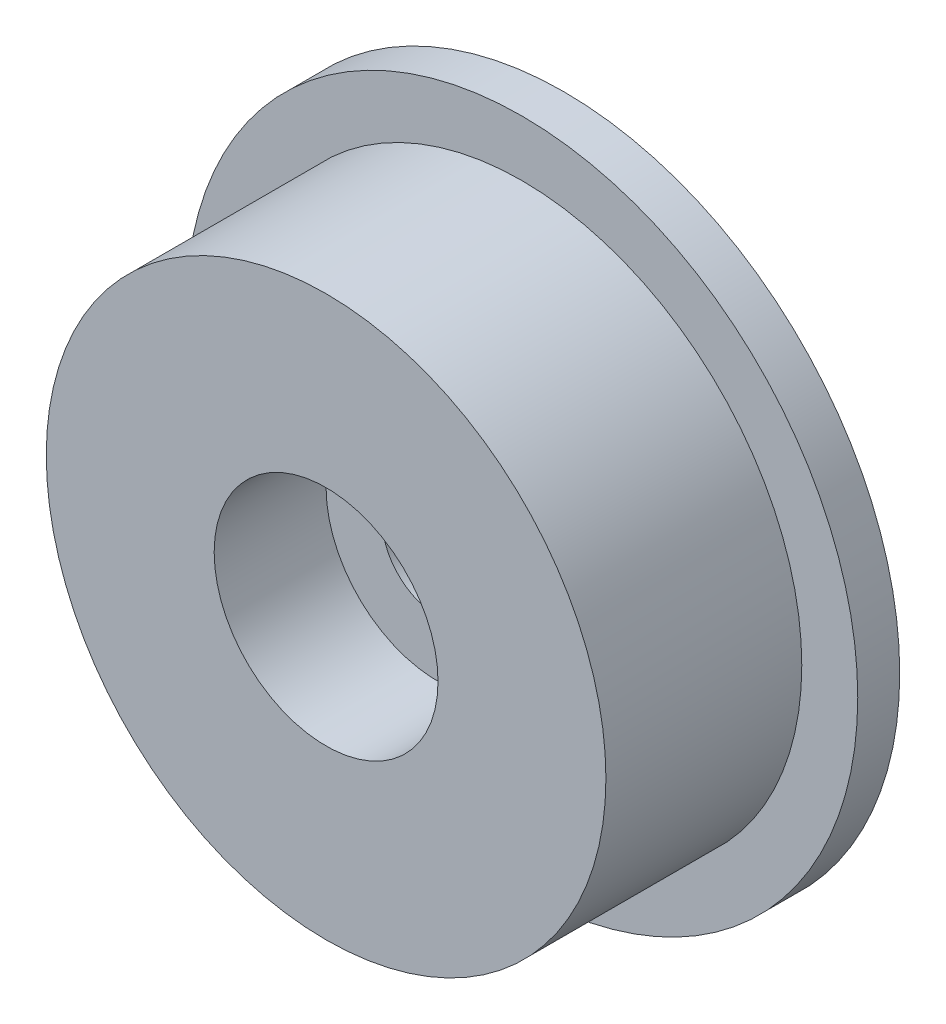
ISO-10303-21;
HEADER;
FILE_DESCRIPTION(('STEP AP214'),'2;1');
FILE_NAME('part.step','',(''),(''),'','','');
FILE_SCHEMA(('AUTOMOTIVE_DESIGN { 1 0 10303 214 1 1 1 1 }'));
ENDSEC;
DATA;
#1=APPLICATION_CONTEXT('core data for automotive mechanical design processes');
#2=APPLICATION_PROTOCOL_DEFINITION('international standard','automotive_design',2000,#1);
#3=PRODUCT_CONTEXT('',#1,'mechanical');
#4=PRODUCT('Part','Part','',(#3));
#5=PRODUCT_RELATED_PRODUCT_CATEGORY('part','',(#4));
#6=PRODUCT_DEFINITION_FORMATION('','',#4);
#7=PRODUCT_DEFINITION_CONTEXT('part definition',#1,'design');
#8=PRODUCT_DEFINITION('design','',#6,#7);
#9=PRODUCT_DEFINITION_SHAPE('','',#8);
#10=(LENGTH_UNIT() NAMED_UNIT(*) SI_UNIT(.MILLI.,.METRE.));
#11=(NAMED_UNIT(*) PLANE_ANGLE_UNIT() SI_UNIT($,.RADIAN.));
#12=(NAMED_UNIT(*) SI_UNIT($,.STERADIAN.) SOLID_ANGLE_UNIT());
#13=UNCERTAINTY_MEASURE_WITH_UNIT(LENGTH_MEASURE(1.E-05),#10,'distance_accuracy_value','');
#14=(GEOMETRIC_REPRESENTATION_CONTEXT(3) GLOBAL_UNCERTAINTY_ASSIGNED_CONTEXT((#13)) GLOBAL_UNIT_ASSIGNED_CONTEXT((#10,
#11,#12)) REPRESENTATION_CONTEXT('',''));
#15=CARTESIAN_POINT('',(0.,0.,0.));
#16=DIRECTION('',(0.,0.,1.));
#17=DIRECTION('',(1.,0.,0.));
#18=AXIS2_PLACEMENT_3D('',#15,#16,#17);
#19=CARTESIAN_POINT('',(0.,0.,27.));
#20=DIRECTION('',(0.,0.,-1.));
#21=DIRECTION('',(-1.,0.,0.));
#22=AXIS2_PLACEMENT_3D('',#19,#20,#21);
#23=CYLINDRICAL_SURFACE('',#22,2.);
#24=CARTESIAN_POINT('',(0.,0.,0.));
#25=DIRECTION('',(0.,0.,-1.));
#26=DIRECTION('',(-1.,0.,0.));
#27=AXIS2_PLACEMENT_3D('',#24,#25,#26);
#28=CIRCLE('',#27,2.);
#29=CARTESIAN_POINT('',(-2.,0.,0.));
#30=VERTEX_POINT('',#29);
#31=EDGE_CURVE('E63',#30,#30,#28,.T.);
#32=ORIENTED_EDGE('',*,*,#31,.T.);
#33=EDGE_LOOP('',(#32));
#34=FACE_BOUND('',#33,.T.);
#35=CARTESIAN_POINT('',(0.,0.,4.5));
#36=DIRECTION('',(0.,0.,1.));
#37=DIRECTION('',(1.,0.,0.));
#38=AXIS2_PLACEMENT_3D('',#35,#36,#37);
#39=CIRCLE('',#38,2.);
#40=CARTESIAN_POINT('',(2.,0.,4.5));
#41=VERTEX_POINT('',#40);
#42=EDGE_CURVE('E41',#41,#41,#39,.F.);
#43=ORIENTED_EDGE('',*,*,#42,.F.);
#44=EDGE_LOOP('',(#43));
#45=FACE_BOUND('',#44,.T.);
#46=ADVANCED_FACE('F37',(#34,#45),#23,.F.);
#47=CARTESIAN_POINT('',(0.,0.,1.5));
#48=DIRECTION('',(0.,0.,-1.));
#49=DIRECTION('',(-1.,0.,0.));
#50=AXIS2_PLACEMENT_3D('',#47,#48,#49);
#51=CYLINDRICAL_SURFACE('',#50,12.);
#52=CARTESIAN_POINT('',(0.,0.,1.5));
#53=DIRECTION('',(0.,0.,1.));
#54=DIRECTION('',(1.,0.,0.));
#55=AXIS2_PLACEMENT_3D('',#52,#53,#54);
#56=CIRCLE('',#55,12.);
#57=CARTESIAN_POINT('',(12.,0.,1.5));
#58=VERTEX_POINT('',#57);
#59=EDGE_CURVE('E46',#58,#58,#56,.T.);
#60=ORIENTED_EDGE('',*,*,#59,.F.);
#61=EDGE_LOOP('',(#60));
#62=FACE_BOUND('',#61,.T.);
#63=CARTESIAN_POINT('',(0.,0.,0.));
#64=DIRECTION('',(0.,0.,1.));
#65=DIRECTION('',(1.,0.,0.));
#66=AXIS2_PLACEMENT_3D('',#63,#64,#65);
#67=CIRCLE('',#66,12.);
#68=CARTESIAN_POINT('',(12.,0.,0.));
#69=VERTEX_POINT('',#68);
#70=EDGE_CURVE('E52',#69,#69,#67,.T.);
#71=ORIENTED_EDGE('',*,*,#70,.T.);
#72=EDGE_LOOP('',(#71));
#73=FACE_BOUND('',#72,.T.);
#74=ADVANCED_FACE('F39',(#62,#73),#51,.T.);
#75=CARTESIAN_POINT('',(0.,0.,1.5));
#76=DIRECTION('',(0.,0.,1.));
#77=DIRECTION('',(1.,0.,0.));
#78=AXIS2_PLACEMENT_3D('',#75,#76,#77);
#79=PLANE('',#78);
#80=CARTESIAN_POINT('',(0.,0.,1.5));
#81=DIRECTION('',(0.,0.,1.));
#82=DIRECTION('',(1.,0.,0.));
#83=AXIS2_PLACEMENT_3D('',#80,#81,#82);
#84=CIRCLE('',#83,10.);
#85=CARTESIAN_POINT('',(10.,0.,1.5));
#86=VERTEX_POINT('',#85);
#87=EDGE_CURVE('E10',#86,#86,#84,.T.);
#88=ORIENTED_EDGE('',*,*,#87,.F.);
#89=EDGE_LOOP('',(#88));
#90=FACE_BOUND('',#89,.T.);
#91=ORIENTED_EDGE('',*,*,#59,.T.);
#92=EDGE_LOOP('',(#91));
#93=FACE_BOUND('',#92,.T.);
#94=ADVANCED_FACE('F108',(#90,#93),#79,.T.);
#95=CARTESIAN_POINT('',(0.,0.,0.));
#96=DIRECTION('',(0.,0.,1.));
#97=DIRECTION('',(1.,0.,0.));
#98=AXIS2_PLACEMENT_3D('',#95,#96,#97);
#99=PLANE('',#98);
#100=ORIENTED_EDGE('',*,*,#31,.F.);
#101=EDGE_LOOP('',(#100));
#102=FACE_BOUND('',#101,.T.);
#103=ORIENTED_EDGE('',*,*,#70,.F.);
#104=EDGE_LOOP('',(#103));
#105=FACE_BOUND('',#104,.T.);
#106=ADVANCED_FACE('F100',(#102,#105),#99,.F.);
#107=CARTESIAN_POINT('',(0.,0.,8.5));
#108=DIRECTION('',(0.,0.,-1.));
#109=DIRECTION('',(-1.,0.,0.));
#110=AXIS2_PLACEMENT_3D('',#107,#108,#109);
#111=CYLINDRICAL_SURFACE('',#110,10.);
#112=CARTESIAN_POINT('',(0.,0.,8.5));
#113=DIRECTION('',(0.,0.,1.));
#114=DIRECTION('',(1.,0.,0.));
#115=AXIS2_PLACEMENT_3D('',#112,#113,#114);
#116=CIRCLE('',#115,10.);
#117=CARTESIAN_POINT('',(10.,0.,8.5));
#118=VERTEX_POINT('',#117);
#119=EDGE_CURVE('E55',#118,#118,#116,.T.);
#120=ORIENTED_EDGE('',*,*,#119,.F.);
#121=EDGE_LOOP('',(#120));
#122=FACE_BOUND('',#121,.T.);
#123=ORIENTED_EDGE('',*,*,#87,.T.);
#124=EDGE_LOOP('',(#123));
#125=FACE_BOUND('',#124,.T.);
#126=ADVANCED_FACE('F93',(#122,#125),#111,.T.);
#127=CARTESIAN_POINT('',(0.,0.,8.5));
#128=DIRECTION('',(0.,0.,1.));
#129=DIRECTION('',(1.,0.,0.));
#130=AXIS2_PLACEMENT_3D('',#127,#128,#129);
#131=PLANE('',#130);
#132=CARTESIAN_POINT('',(0.,0.,8.5));
#133=DIRECTION('',(0.,0.,1.));
#134=DIRECTION('',(1.,0.,0.));
#135=AXIS2_PLACEMENT_3D('',#132,#133,#134);
#136=CIRCLE('',#135,4.);
#137=CARTESIAN_POINT('',(4.,0.,8.5));
#138=VERTEX_POINT('',#137);
#139=EDGE_CURVE('E74',#138,#138,#136,.T.);
#140=ORIENTED_EDGE('',*,*,#139,.F.);
#141=EDGE_LOOP('',(#140));
#142=FACE_BOUND('',#141,.T.);
#143=ORIENTED_EDGE('',*,*,#119,.T.);
#144=EDGE_LOOP('',(#143));
#145=FACE_BOUND('',#144,.T.);
#146=ADVANCED_FACE('F91',(#142,#145),#131,.T.);
#147=CARTESIAN_POINT('',(0.,0.,4.5));
#148=DIRECTION('',(0.,0.,1.));
#149=DIRECTION('',(1.,0.,0.));
#150=AXIS2_PLACEMENT_3D('',#147,#148,#149);
#151=PLANE('',#150);
#152=CARTESIAN_POINT('',(0.,0.,4.5));
#153=DIRECTION('',(0.,0.,1.));
#154=DIRECTION('',(1.,0.,0.));
#155=AXIS2_PLACEMENT_3D('',#152,#153,#154);
#156=CIRCLE('',#155,4.);
#157=CARTESIAN_POINT('',(4.,0.,4.5));
#158=VERTEX_POINT('',#157);
#159=EDGE_CURVE('E72',#158,#158,#156,.T.);
#160=ORIENTED_EDGE('',*,*,#159,.T.);
#161=EDGE_LOOP('',(#160));
#162=FACE_BOUND('',#161,.T.);
#163=ORIENTED_EDGE('',*,*,#42,.T.);
#164=EDGE_LOOP('',(#163));
#165=FACE_BOUND('',#164,.T.);
#166=ADVANCED_FACE('F82',(#162,#165),#151,.T.);
#167=CARTESIAN_POINT('',(0.,0.,4.5));
#168=DIRECTION('',(0.,0.,1.));
#169=DIRECTION('',(1.,0.,0.));
#170=AXIS2_PLACEMENT_3D('',#167,#168,#169);
#171=CYLINDRICAL_SURFACE('',#170,4.);
#172=ORIENTED_EDGE('',*,*,#159,.F.);
#173=EDGE_LOOP('',(#172));
#174=FACE_BOUND('',#173,.T.);
#175=ORIENTED_EDGE('',*,*,#139,.T.);
#176=EDGE_LOOP('',(#175));
#177=FACE_BOUND('',#176,.T.);
#178=ADVANCED_FACE('F85',(#174,#177),#171,.F.);
#179=CLOSED_SHELL('',(#46,#74,#94,#106,#126,#146,#166,#178));
#180=MANIFOLD_SOLID_BREP('B2',#179);
#181=ADVANCED_BREP_SHAPE_REPRESENTATION('',(#18,#180),#14);
#182=SHAPE_DEFINITION_REPRESENTATION(#9,#181);
ENDSEC;
END-ISO-10303-21;
